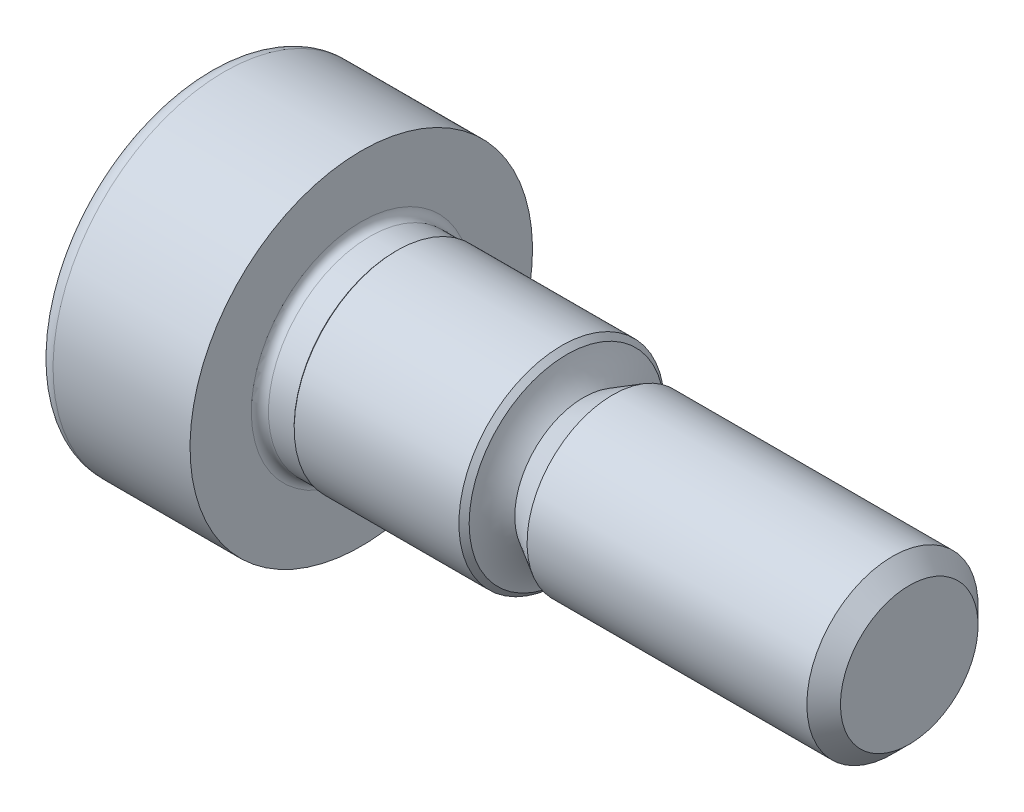
ISO-10303-21;
HEADER;
FILE_DESCRIPTION(('STEP AP214'),'2;1');
FILE_NAME('part.step','',(''),(''),'','','');
FILE_SCHEMA(('AUTOMOTIVE_DESIGN { 1 0 10303 214 1 1 1 1 }'));
ENDSEC;
DATA;
#1=APPLICATION_CONTEXT('core data for automotive mechanical design processes');
#2=APPLICATION_PROTOCOL_DEFINITION('international standard','automotive_design',2000,#1);
#3=PRODUCT_CONTEXT('',#1,'mechanical');
#4=PRODUCT('Part','Part','',(#3));
#5=PRODUCT_RELATED_PRODUCT_CATEGORY('part','',(#4));
#6=PRODUCT_DEFINITION_FORMATION('','',#4);
#7=PRODUCT_DEFINITION_CONTEXT('part definition',#1,'design');
#8=PRODUCT_DEFINITION('design','',#6,#7);
#9=PRODUCT_DEFINITION_SHAPE('','',#8);
#10=(LENGTH_UNIT() NAMED_UNIT(*) SI_UNIT(.MILLI.,.METRE.));
#11=(NAMED_UNIT(*) PLANE_ANGLE_UNIT() SI_UNIT($,.RADIAN.));
#12=(NAMED_UNIT(*) SI_UNIT($,.STERADIAN.) SOLID_ANGLE_UNIT());
#13=UNCERTAINTY_MEASURE_WITH_UNIT(LENGTH_MEASURE(1.E-05),#10,'distance_accuracy_value','');
#14=(GEOMETRIC_REPRESENTATION_CONTEXT(3) GLOBAL_UNCERTAINTY_ASSIGNED_CONTEXT((#13)) GLOBAL_UNIT_ASSIGNED_CONTEXT((#10,
#11,#12)) REPRESENTATION_CONTEXT('',''));
#15=CARTESIAN_POINT('',(0.,0.,0.));
#16=DIRECTION('',(0.,0.,1.));
#17=DIRECTION('',(1.,0.,0.));
#18=AXIS2_PLACEMENT_3D('',#15,#16,#17);
#19=CARTESIAN_POINT('',(-4.5,-0.866025403784439,1.5));
#20=DIRECTION('',(0.,0.,1.));
#21=DIRECTION('',(1.,0.,0.));
#22=AXIS2_PLACEMENT_3D('',#19,#20,#21);
#23=PLANE('',#22);
#24=DIRECTION('',(1.,0.,0.));
#25=VECTOR('',#24,1.);
#26=CARTESIAN_POINT('',(-4.5,-0.86602540378444,1.5));
#27=LINE('',#26,#25);
#28=CARTESIAN_POINT('',(-2.09999998876295,-0.866025360297812,1.5));
#29=VERTEX_POINT('',#28);
#30=CARTESIAN_POINT('',(-4.5,-0.866025403784439,1.5));
#31=VERTEX_POINT('',#30);
#32=EDGE_CURVE('E297',#29,#31,#27,.F.);
#33=ORIENTED_EDGE('',*,*,#32,.T.);
#34=DIRECTION('',(0.,1.,0.));
#35=VECTOR('',#34,1.);
#36=CARTESIAN_POINT('',(-4.5,-0.866025403784439,1.5));
#37=LINE('',#36,#35);
#38=CARTESIAN_POINT('',(-4.5,0.866025403784439,1.5));
#39=VERTEX_POINT('',#38);
#40=EDGE_CURVE('E300',#39,#31,#37,.F.);
#41=ORIENTED_EDGE('',*,*,#40,.F.);
#42=DIRECTION('',(1.,0.,0.));
#43=VECTOR('',#42,1.);
#44=CARTESIAN_POINT('',(-4.5,0.866025403784439,1.5));
#45=LINE('',#44,#43);
#46=CARTESIAN_POINT('',(-2.09999998876207,0.866025425529268,1.49999996233685));
#47=VERTEX_POINT('',#46);
#48=EDGE_CURVE('E94',#39,#47,#45,.T.);
#49=ORIENTED_EDGE('',*,*,#48,.T.);
#50=CARTESIAN_POINT('',(-2.10000003335591,0.86602543025043,1.499999962732));
#51=CARTESIAN_POINT('',(-2.07802167621575,0.789912288066063,1.49999998661501));
#52=CARTESIAN_POINT('',(-2.05803351786078,0.713142136048893,1.4999999964126));
#53=CARTESIAN_POINT('',(-2.02314479379748,0.558272606373841,1.50000000359603));
#54=CARTESIAN_POINT('',(-2.00825656905145,0.480170477878372,1.50000000095198));
#55=CARTESIAN_POINT('',(-1.98508197247781,0.324934102243753,1.49999999907158));
#56=CARTESIAN_POINT('',(-1.97664134289848,0.247823733513013,1.49999999975251));
#57=CARTESIAN_POINT('',(-1.96656687708559,0.0932403553060011,1.50000000024718));
#58=CARTESIAN_POINT('',(-1.96492469633022,0.0157679073123937,1.50000000006199));
#59=CARTESIAN_POINT('',(-1.96834971826331,-0.128981041425857,1.49999999994604));
#60=CARTESIAN_POINT('',(-1.97257596373675,-0.196279262955207,1.49999999998546));
#61=CARTESIAN_POINT('',(-1.98596797275123,-0.33043728007815,1.50000000001456));
#62=CARTESIAN_POINT('',(-1.99513830649323,-0.397296612001995,1.5000000000042));
#63=CARTESIAN_POINT('',(-2.01806236601585,-0.53173100748732,1.49999999999571));
#64=CARTESIAN_POINT('',(-2.03191322005288,-0.599289065147196,1.49999999999786));
#65=CARTESIAN_POINT('',(-2.0633488032568,-0.733397843696797,1.50000000000214));
#66=CARTESIAN_POINT('',(-2.08092615106047,-0.799950281347834,1.50000000000428));
#67=CARTESIAN_POINT('',(-2.09999997622052,-0.866025316849562,1.5));
#68=B_SPLINE_CURVE_WITH_KNOTS('',3,(#50,#51,#52,#53,#54,#55,#56,#57,#58,#59,#60,#61,#62,#63,#64,
#65,#66,#67),.UNSPECIFIED.,.F.,.F.,(4,2,2,2,2,2,2,2,4),(0.,0.237762017438136,0.476095379636202,
0.708530728268836,0.940680697400191,1.1427808461068,1.34506813263149,1.55184118196356,
1.7582084234658),.UNSPECIFIED.);
#69=EDGE_CURVE('E93',#47,#29,#68,.T.);
#70=ORIENTED_EDGE('',*,*,#69,.T.);
#71=EDGE_LOOP('',(#33,#41,#49,#70));
#72=FACE_BOUND('',#71,.T.);
#73=ADVANCED_FACE('F17',(#72),#23,.F.);
#74=CARTESIAN_POINT('',(-4.5,-1.73205080756888,0.));
#75=DIRECTION('',(0.,-0.866025403784439,0.5));
#76=DIRECTION('',(0.,-0.5,-0.866025403784439));
#77=AXIS2_PLACEMENT_3D('',#74,#75,#76);
#78=PLANE('',#77);
#79=DIRECTION('',(1.,0.,0.));
#80=VECTOR('',#79,1.);
#81=CARTESIAN_POINT('',(-4.5,-1.73205080756888,0.));
#82=LINE('',#81,#80);
#83=CARTESIAN_POINT('',(-2.09999998876401,-1.7320507858274,3.76573399172149E-08));
#84=VERTEX_POINT('',#83);
#85=CARTESIAN_POINT('',(-4.5,-1.73205080756888,0.));
#86=VERTEX_POINT('',#85);
#87=EDGE_CURVE('E291',#84,#86,#82,.F.);
#88=ORIENTED_EDGE('',*,*,#87,.T.);
#89=DIRECTION('',(0.,-0.5,-0.866025403784439));
#90=VECTOR('',#89,1.);
#91=CARTESIAN_POINT('',(-4.5,-1.73205080756888,0.));
#92=LINE('',#91,#90);
#93=EDGE_CURVE('E294',#31,#86,#92,.T.);
#94=ORIENTED_EDGE('',*,*,#93,.F.);
#95=ORIENTED_EDGE('',*,*,#32,.F.);
#96=CARTESIAN_POINT('',(-2.10000003335301,-0.866025358280918,1.50000000428221));
#97=CARTESIAN_POINT('',(-2.07802167621377,-0.904081950055329,1.4340841015296));
#98=CARTESIAN_POINT('',(-2.05803351785928,-0.942467034548381,1.36759920452899));
#99=CARTESIAN_POINT('',(-2.02314479379654,-1.01990180560644,1.23347826115009));
#100=CARTESIAN_POINT('',(-2.0082565690506,-1.05895286756437,1.16583983246162));
#101=CARTESIAN_POINT('',(-1.98508197247722,-1.13657105375308,1.03140118663082));
#102=CARTESIAN_POINT('',(-1.97664134289806,-1.17512623870803,0.964621648755426));
#103=CARTESIAN_POINT('',(-1.96656687708545,-1.25241792823972,0.830748516473002));
#104=CARTESIAN_POINT('',(-1.96492469633021,-1.29115415207604,0.763655408324757));
#105=CARTESIAN_POINT('',(-1.96834971826349,-1.3635286263448,0.638299141488293));
#106=CARTESIAN_POINT('',(-1.97257596373706,-1.39717773714376,0.580017172033811));
#107=CARTESIAN_POINT('',(-1.98596797275181,-1.46425674573073,0.463832921098034));
#108=CARTESIAN_POINT('',(-1.99513830649398,-1.49768641168382,0.405931041166498));
#109=CARTESIAN_POINT('',(-2.01806236601693,-1.56490360941942,0.289507439529062));
#110=CARTESIAN_POINT('',(-2.03191322005415,-1.59868263825136,0.231000445366106));
#111=CARTESIAN_POINT('',(-2.06334880325844,-1.66573702753014,0.114858836273319));
#112=CARTESIAN_POINT('',(-2.0809261510623,-1.69901324635764,0.0572227345845793));
#113=CARTESIAN_POINT('',(-2.09999997622254,-1.73205076410493,7.52817598523479E-08));
#114=B_SPLINE_CURVE_WITH_KNOTS('',3,(#96,#97,#98,#99,#100,#101,#102,#103,#104,#105,#106,#107,
#108,#109,#110,#111,#112,#113),.UNSPECIFIED.,.F.,.F.,(4,2,2,2,2,2,2,2,4),(0.,0.237762017437402,
0.476095379634763,0.708530728266777,0.9406806973975,1.14278084610503,1.34506813263064,
1.55184118196365,1.7582084234668),.UNSPECIFIED.);
#115=EDGE_CURVE('E134',#29,#84,#114,.T.);
#116=ORIENTED_EDGE('',*,*,#115,.T.);
#117=EDGE_LOOP('',(#88,#94,#95,#116));
#118=FACE_BOUND('',#117,.T.);
#119=ADVANCED_FACE('F138',(#118),#78,.F.);
#120=CARTESIAN_POINT('',(-4.5,-0.86602540378444,-1.5));
#121=DIRECTION('',(0.,-0.866025403784439,-0.5));
#122=DIRECTION('',(0.,0.5,-0.866025403784439));
#123=AXIS2_PLACEMENT_3D('',#120,#121,#122);
#124=PLANE('',#123);
#125=DIRECTION('',(-1.,0.,0.));
#126=VECTOR('',#125,1.);
#127=CARTESIAN_POINT('',(-4.5,-0.866025403784439,-1.5));
#128=LINE('',#127,#126);
#129=CARTESIAN_POINT('',(-2.09999998876513,-0.866025425523976,-1.49999996234602));
#130=VERTEX_POINT('',#129);
#131=CARTESIAN_POINT('',(-4.5,-0.866025403784439,-1.5));
#132=VERTEX_POINT('',#131);
#133=EDGE_CURVE('E282',#130,#132,#128,.T.);
#134=ORIENTED_EDGE('',*,*,#133,.T.);
#135=DIRECTION('',(0.,0.5,-0.866025403784439));
#136=VECTOR('',#135,1.);
#137=CARTESIAN_POINT('',(-4.5,-0.86602540378444,-1.5));
#138=LINE('',#137,#136);
#139=EDGE_CURVE('E285',#86,#132,#138,.T.);
#140=ORIENTED_EDGE('',*,*,#139,.F.);
#141=ORIENTED_EDGE('',*,*,#87,.F.);
#142=CARTESIAN_POINT('',(-2.1000000333495,-1.73205078852413,4.15411377184599E-08));
#143=CARTESIAN_POINT('',(-2.07802167621137,-1.69399423811292,-0.0659158850925118));
#144=CARTESIAN_POINT('',(-2.05803351785746,-1.65560917058849,-0.132400791889771));
#145=CARTESIAN_POINT('',(-2.02314479379541,-1.57817441197169,-0.266521742451139));
#146=CARTESIAN_POINT('',(-2.00825656904958,-1.53912334543465,-0.334160168495541));
#147=CARTESIAN_POINT('',(-1.98508197247651,-1.46150515598951,-0.468598812445655));
#148=CARTESIAN_POINT('',(-1.97664134289755,-1.42294997221399,-0.535378351001732));
#149=CARTESIAN_POINT('',(-1.9665668770853,-1.34565828353927,-0.669251483778371));
#150=CARTESIAN_POINT('',(-1.96492469633019,-1.30692205938233,-0.736344591741212));
#151=CARTESIAN_POINT('',(-1.96834971826371,-1.23454758491275,-0.861700858461751));
#152=CARTESIAN_POINT('',(-1.97257596373742,-1.20089847418193,-0.91998282795588));
#153=CARTESIAN_POINT('',(-1.98596797275248,-1.13381946564509,-1.03616707892122));
#154=CARTESIAN_POINT('',(-1.99513830649481,-1.10038979967393,-1.09406895884262));
#155=CARTESIAN_POINT('',(-2.01806236601812,-1.03317260192337,-1.21049256047201));
#156=CARTESIAN_POINT('',(-2.03191322005552,-0.99939357309503,-1.26899955463732));
#157=CARTESIAN_POINT('',(-2.06334880326019,-0.932339183823426,-1.38514116373481));
#158=CARTESIAN_POINT('',(-2.08092615106424,-0.899062964999509,-1.44277726542588));
#159=CARTESIAN_POINT('',(-2.09999997622466,-0.866025447244699,-1.49999992472462));
#160=B_SPLINE_CURVE_WITH_KNOTS('',3,(#142,#143,#144,#145,#146,#147,#148,#149,#150,#151,#152,
#153,#154,#155,#156,#157,#158,#159),.UNSPECIFIED.,.F.,.F.,(4,2,2,2,2,2,2,2,4),(0.,
0.237762017436511,0.476095379633014,0.708530728264277,0.940680697394235,1.14278084610259,
1.34506813262905,1.55184118196289,1.75820842346686),.UNSPECIFIED.);
#161=EDGE_CURVE('E129',#84,#130,#160,.T.);
#162=ORIENTED_EDGE('',*,*,#161,.T.);
#163=EDGE_LOOP('',(#134,#140,#141,#162));
#164=FACE_BOUND('',#163,.T.);
#165=ADVANCED_FACE('F141',(#164),#124,.F.);
#166=CARTESIAN_POINT('',(-4.5,0.866025403784438,-1.5));
#167=DIRECTION('',(0.,0.,-1.));
#168=DIRECTION('',(-1.,0.,0.));
#169=AXIS2_PLACEMENT_3D('',#166,#167,#168);
#170=PLANE('',#169);
#171=DIRECTION('',(1.,0.,0.));
#172=VECTOR('',#171,1.);
#173=CARTESIAN_POINT('',(-4.5,0.86602540378444,-1.5));
#174=LINE('',#173,#172);
#175=CARTESIAN_POINT('',(-2.09999999352039,0.866025352058319,-1.50000001427197));
#176=VERTEX_POINT('',#175);
#177=CARTESIAN_POINT('',(-4.5,0.866025403784439,-1.5));
#178=VERTEX_POINT('',#177);
#179=EDGE_CURVE('E85',#176,#178,#174,.F.);
#180=ORIENTED_EDGE('',*,*,#179,.T.);
#181=DIRECTION('',(0.,1.,0.));
#182=VECTOR('',#181,1.);
#183=CARTESIAN_POINT('',(-4.5,0.866025403784438,-1.5));
#184=LINE('',#183,#182);
#185=EDGE_CURVE('E41',#132,#178,#184,.T.);
#186=ORIENTED_EDGE('',*,*,#185,.F.);
#187=ORIENTED_EDGE('',*,*,#133,.F.);
#188=CARTESIAN_POINT('',(-2.10000003334579,-0.866025430230415,-1.49999996273862));
#189=CARTESIAN_POINT('',(-2.07802167620883,-0.789912288046103,-1.49999998661738));
#190=CARTESIAN_POINT('',(-2.05803351785554,-0.713142136029389,-1.49999999641323));
#191=CARTESIAN_POINT('',(-2.02314479379422,-0.558272606355601,-1.50000000359539));
#192=CARTESIAN_POINT('',(-2.0082565690485,-0.480170477860938,-1.50000000095181));
#193=CARTESIAN_POINT('',(-1.98508197247576,-0.324934102227769,-1.49999999907174));
#194=CARTESIAN_POINT('',(-1.97664134289702,-0.247823733497672,-1.49999999975256));
#195=CARTESIAN_POINT('',(-1.96656687708513,-0.093240355292028,-1.50000000024714));
#196=CARTESIAN_POINT('',(-1.96492469633017,-0.0157679072991463,-1.50000000006198));
#197=CARTESIAN_POINT('',(-1.9683497182639,0.128981041437423,-1.49999999994605));
#198=CARTESIAN_POINT('',(-1.97257596373757,0.196279262965822,-1.49999999998546));
#199=CARTESIAN_POINT('',(-1.98596797275234,0.330437280086866,-1.50000000001456));
#200=CARTESIAN_POINT('',(-1.9951383064944,0.397296612009763,-1.5000000000042));
#201=CARTESIAN_POINT('',(-2.01806236601699,0.531731007493114,-1.49999999999571));
#202=CARTESIAN_POINT('',(-2.03191322005393,0.599289065151964,-1.49999999999786));
#203=CARTESIAN_POINT('',(-2.06334880325752,0.73339784369953,-1.50000000000214));
#204=CARTESIAN_POINT('',(-2.08092615106096,0.799950281349558,-1.50000000000427));
#205=CARTESIAN_POINT('',(-2.09999997622073,0.866025316850293,-1.5));
#206=B_SPLINE_CURVE_WITH_KNOTS('',3,(#188,#189,#190,#191,#192,#193,#194,#195,#196,#197,#198,
#199,#200,#201,#202,#203,#204,#205),.UNSPECIFIED.,.F.,.F.,(4,2,2,2,2,2,2,2,4),(0.,
0.23776201743555,0.476095379631123,0.708530728261617,0.940680697390792,1.1427808460946,
1.34506813261651,1.55184118194551,1.75820842344466),.UNSPECIFIED.);
#207=EDGE_CURVE('E108',#130,#176,#206,.T.);
#208=ORIENTED_EDGE('',*,*,#207,.T.);
#209=EDGE_LOOP('',(#180,#186,#187,#208));
#210=FACE_BOUND('',#209,.T.);
#211=ADVANCED_FACE('F145',(#210),#170,.F.);
#212=CARTESIAN_POINT('',(-4.5,0.866025403784439,1.5));
#213=DIRECTION('',(0.,0.866025403784439,0.5));
#214=DIRECTION('',(0.,-0.5,0.866025403784439));
#215=AXIS2_PLACEMENT_3D('',#212,#213,#214);
#216=PLANE('',#215);
#217=ORIENTED_EDGE('',*,*,#48,.F.);
#218=DIRECTION('',(0.,-0.5,0.866025403784439));
#219=VECTOR('',#218,1.);
#220=CARTESIAN_POINT('',(-4.5,0.866025403784439,1.5));
#221=LINE('',#220,#219);
#222=CARTESIAN_POINT('',(-4.5,1.73205080756888,0.));
#223=VERTEX_POINT('',#222);
#224=EDGE_CURVE('E80',#223,#39,#221,.T.);
#225=ORIENTED_EDGE('',*,*,#224,.F.);
#226=DIRECTION('',(1.,0.,0.));
#227=VECTOR('',#226,1.);
#228=CARTESIAN_POINT('',(-4.5,1.73205080756888,0.));
#229=LINE('',#228,#227);
#230=CARTESIAN_POINT('',(-2.09999998876953,1.73205078583697,3.76407683635191E-08));
#231=VERTEX_POINT('',#230);
#232=EDGE_CURVE('E75',#223,#231,#229,.T.);
#233=ORIENTED_EDGE('',*,*,#232,.T.);
#234=CARTESIAN_POINT('',(-2.09999997607234,1.73205076434208,7.53682930359305E-08));
#235=CARTESIAN_POINT('',(-2.07802163700995,1.69399419326496,0.065915989717045));
#236=CARTESIAN_POINT('',(-2.05803348815855,1.65560911849432,0.132400889341389));
#237=CARTESIAN_POINT('',(-2.02314477534975,1.57817435719423,0.266521830089263));
#238=CARTESIAN_POINT('',(-2.0082565523481,1.5391232952474,0.334160253505964));
#239=CARTESIAN_POINT('',(-1.98508196087722,1.46150511154693,0.468598891291491));
#240=CARTESIAN_POINT('',(-1.97664133465609,1.42294992899799,0.535378426352266));
#241=CARTESIAN_POINT('',(-1.96656687450187,1.34565824376655,0.669251552169136));
#242=CARTESIAN_POINT('',(-1.96492469604129,1.30692202182537,0.736344656666988));
#243=CARTESIAN_POINT('',(-1.968349721606,1.23454755239127,0.861700914899243));
#244=CARTESIAN_POINT('',(-1.97257596833489,1.20089844449588,0.919982879402893));
#245=CARTESIAN_POINT('',(-1.9859679788723,1.13381944165857,1.03616712043779));
#246=CARTESIAN_POINT('',(-1.99513831288396,1.10038977855167,1.09406899541898));
#247=CARTESIAN_POINT('',(-2.01806237202797,1.03317258674697,1.21049258676694));
#248=CARTESIAN_POINT('',(-2.03191322536921,0.999393560996331,1.2689995755972));
#249=CARTESIAN_POINT('',(-2.06334880642921,0.932339177826785,1.38514117411699));
#250=CARTESIAN_POINT('',(-2.08092615278305,0.899062962027001,1.44277727056581));
#251=CARTESIAN_POINT('',(-2.09999997621886,0.866025447254756,1.4999999247072));
#252=B_SPLINE_CURVE_WITH_KNOTS('',3,(#234,#235,#236,#237,#238,#239,#240,#241,#242,#243,#244,
#245,#246,#247,#248,#249,#250,#251),.UNSPECIFIED.,.F.,.F.,(4,2,2,2,2,2,2,2,4),(0.,
0.237762002787343,0.476095350855917,0.708530687368618,0.940680644156362,1.14278077595019,
1.34506804567278,1.55184107652068,1.75820829940149),.UNSPECIFIED.);
#253=EDGE_CURVE('E21',#231,#47,#252,.T.);
#254=ORIENTED_EDGE('',*,*,#253,.T.);
#255=EDGE_LOOP('',(#217,#225,#233,#254));
#256=FACE_BOUND('',#255,.T.);
#257=ADVANCED_FACE('F78',(#256),#216,.F.);
#258=CARTESIAN_POINT('',(-2.10600000099248,0.,0.));
#259=DIRECTION('',(-1.,0.,0.));
#260=DIRECTION('',(0.,0.,1.));
#261=AXIS2_PLACEMENT_3D('',#258,#259,#260);
#262=CONICAL_SURFACE('',#261,1.74244311182292,1.04719754993706);
#263=CARTESIAN_POINT('',(-1.09999999847332,-1.13686837721616E-10,0.));
#264=VERTEX_POINT('',#263);
#265=VERTEX_LOOP('',#264);
#266=FACE_BOUND('',#265,.T.);
#267=ORIENTED_EDGE('',*,*,#207,.F.);
#268=ORIENTED_EDGE('',*,*,#161,.F.);
#269=ORIENTED_EDGE('',*,*,#115,.F.);
#270=ORIENTED_EDGE('',*,*,#69,.F.);
#271=ORIENTED_EDGE('',*,*,#253,.F.);
#272=CARTESIAN_POINT('',(-2.10000003333847,1.7320507885456,4.15377531092966E-08));
#273=CARTESIAN_POINT('',(-2.07802167619792,1.69399423810413,-0.0659158851223118));
#274=CARTESIAN_POINT('',(-2.05803351783864,1.65560917055646,-0.132400791949155));
#275=CARTESIAN_POINT('',(-2.02314479376596,1.57817441189658,-0.266521742577318));
#276=CARTESIAN_POINT('',(-2.0082565690152,1.53912334533968,-0.334160168659002));
#277=CARTESIAN_POINT('',(-1.98508197245359,1.46150515589311,-0.468598812613634));
#278=CARTESIAN_POINT('',(-1.97664134288449,1.42294997213657,-0.535378351136093));
#279=CARTESIAN_POINT('',(-1.96656687708362,1.34565828350371,-0.669251483839694));
#280=CARTESIAN_POINT('',(-1.96492469632972,1.30692205936966,-0.7363445917631));
#281=CARTESIAN_POINT('',(-1.96834971849202,1.23454758010802,-0.861700866783856));
#282=CARTESIAN_POINT('',(-1.97257596494851,1.20089846457259,-0.919982844599752));
#283=CARTESIAN_POINT('',(-1.98596797728177,1.13381944650639,-1.0361671120704));
#284=CARTESIAN_POINT('',(-1.99513831336272,1.10038977581065,-1.09406900017503));
#285=CARTESIAN_POINT('',(-2.01806237871744,1.03317256850163,-1.21049261836016));
#286=CARTESIAN_POINT('',(-2.03191323628987,0.999393534844095,-1.26899962088989));
#287=CARTESIAN_POINT('',(-2.06334882733353,0.932339136089832,-1.38514124641182));
#288=CARTESIAN_POINT('',(-2.08092617943684,0.899062912611812,-1.44277735616403));
#289=CARTESIAN_POINT('',(-2.10000000912008,0.866025390268167,-1.50000002341087));
#290=B_SPLINE_CURVE_WITH_KNOTS('',3,(#272,#273,#274,#275,#276,#277,#278,#279,#280,#281,#282,
#283,#284,#285,#286,#287,#288,#289),.UNSPECIFIED.,.F.,.F.,(4,2,2,2,2,2,2,2,4),(0.,
0.237762017548545,0.47609537987229,0.708530728384054,0.940680697383601,1.14278087496024,
1.34506819046188,1.55184127027516,1.75820854202636),.UNSPECIFIED.);
#291=EDGE_CURVE('E84',#231,#176,#290,.T.);
#292=ORIENTED_EDGE('',*,*,#291,.T.);
#293=EDGE_LOOP('',(#267,#268,#269,#270,#271,#292));
#294=FACE_BOUND('',#293,.T.);
#295=ADVANCED_FACE('F90',(#266,#294),#262,.F.);
#296=CARTESIAN_POINT('',(-4.5,1.73205080756888,0.));
#297=DIRECTION('',(0.,0.866025403784439,-0.5));
#298=DIRECTION('',(0.,0.5,0.866025403784439));
#299=AXIS2_PLACEMENT_3D('',#296,#297,#298);
#300=PLANE('',#299);
#301=ORIENTED_EDGE('',*,*,#232,.F.);
#302=DIRECTION('',(0.,0.5,0.866025403784438));
#303=VECTOR('',#302,1.);
#304=CARTESIAN_POINT('',(-4.5,0.866025403784438,-1.5));
#305=LINE('',#304,#303);
#306=EDGE_CURVE('E96',#178,#223,#305,.T.);
#307=ORIENTED_EDGE('',*,*,#306,.F.);
#308=ORIENTED_EDGE('',*,*,#179,.F.);
#309=ORIENTED_EDGE('',*,*,#291,.F.);
#310=EDGE_LOOP('',(#301,#307,#308,#309));
#311=FACE_BOUND('',#310,.T.);
#312=ADVANCED_FACE('F95',(#311),#300,.F.);
#313=CARTESIAN_POINT('',(-4.5,3.36602540378444,0.));
#314=DIRECTION('',(-1.,0.,0.));
#315=DIRECTION('',(0.,0.,1.));
#316=AXIS2_PLACEMENT_3D('',#313,#314,#315);
#317=PLANE('',#316);
#318=ORIENTED_EDGE('',*,*,#185,.T.);
#319=ORIENTED_EDGE('',*,*,#306,.T.);
#320=ORIENTED_EDGE('',*,*,#224,.T.);
#321=ORIENTED_EDGE('',*,*,#40,.T.);
#322=ORIENTED_EDGE('',*,*,#93,.T.);
#323=ORIENTED_EDGE('',*,*,#139,.T.);
#324=EDGE_LOOP('',(#318,#319,#320,#321,#322,#323));
#325=FACE_BOUND('',#324,.T.);
#326=CARTESIAN_POINT('',(-4.5,0.,0.));
#327=DIRECTION('',(1.,0.,0.));
#328=DIRECTION('',(0.,1.,0.));
#329=AXIS2_PLACEMENT_3D('',#326,#327,#328);
#330=CIRCLE('',#329,4.5);
#331=CARTESIAN_POINT('',(-4.5,4.5,0.));
#332=VERTEX_POINT('',#331);
#333=EDGE_CURVE('E98',#332,#332,#330,.T.);
#334=ORIENTED_EDGE('',*,*,#333,.F.);
#335=EDGE_LOOP('',(#334));
#336=FACE_BOUND('',#335,.T.);
#337=ADVANCED_FACE('F254',(#325,#336),#317,.T.);
#338=CARTESIAN_POINT('',(-4.,0.,0.));
#339=DIRECTION('',(1.,0.,0.));
#340=DIRECTION('',(0.,0.,-1.));
#341=AXIS2_PLACEMENT_3D('',#338,#339,#340);
#342=TOROIDAL_SURFACE('',#341,4.5,0.5);
#343=CARTESIAN_POINT('',(-4.,0.,0.));
#344=DIRECTION('',(1.,0.,0.));
#345=DIRECTION('',(0.,1.,0.));
#346=AXIS2_PLACEMENT_3D('',#343,#344,#345);
#347=CIRCLE('',#346,5.);
#348=CARTESIAN_POINT('',(-4.,5.,0.));
#349=VERTEX_POINT('',#348);
#350=EDGE_CURVE('E235',#349,#349,#347,.T.);
#351=ORIENTED_EDGE('',*,*,#350,.F.);
#352=EDGE_LOOP('',(#351));
#353=FACE_BOUND('',#352,.T.);
#354=ORIENTED_EDGE('',*,*,#333,.T.);
#355=EDGE_LOOP('',(#354));
#356=FACE_BOUND('',#355,.T.);
#357=ADVANCED_FACE('F250',(#353,#356),#342,.T.);
#358=CARTESIAN_POINT('',(-2.25,0.,0.));
#359=DIRECTION('',(1.,0.,0.));
#360=DIRECTION('',(0.,1.,0.));
#361=AXIS2_PLACEMENT_3D('',#358,#359,#360);
#362=CYLINDRICAL_SURFACE('',#361,5.);
#363=ORIENTED_EDGE('',*,*,#350,.T.);
#364=EDGE_LOOP('',(#363));
#365=FACE_BOUND('',#364,.T.);
#366=CARTESIAN_POINT('',(0.,0.,0.));
#367=DIRECTION('',(1.,0.,0.));
#368=DIRECTION('',(0.,1.,0.));
#369=AXIS2_PLACEMENT_3D('',#366,#367,#368);
#370=CIRCLE('',#369,5.);
#371=CARTESIAN_POINT('',(0.,5.,0.));
#372=VERTEX_POINT('',#371);
#373=EDGE_CURVE('E106',#372,#372,#370,.T.);
#374=ORIENTED_EDGE('',*,*,#373,.F.);
#375=EDGE_LOOP('',(#374));
#376=FACE_BOUND('',#375,.T.);
#377=ADVANCED_FACE('F253',(#365,#376),#362,.T.);
#378=CARTESIAN_POINT('',(0.,4.,0.));
#379=DIRECTION('',(1.,0.,0.));
#380=DIRECTION('',(0.,0.,-1.));
#381=AXIS2_PLACEMENT_3D('',#378,#379,#380);
#382=PLANE('',#381);
#383=CARTESIAN_POINT('',(0.,0.,0.));
#384=DIRECTION('',(1.,0.,0.));
#385=DIRECTION('',(0.,1.,0.));
#386=AXIS2_PLACEMENT_3D('',#383,#384,#385);
#387=CIRCLE('',#386,3.21);
#388=CARTESIAN_POINT('',(0.,3.21,0.));
#389=VERTEX_POINT('',#388);
#390=EDGE_CURVE('E210',#389,#389,#387,.F.);
#391=ORIENTED_EDGE('',*,*,#390,.T.);
#392=EDGE_LOOP('',(#391));
#393=FACE_BOUND('',#392,.T.);
#394=ORIENTED_EDGE('',*,*,#373,.T.);
#395=EDGE_LOOP('',(#394));
#396=FACE_BOUND('',#395,.T.);
#397=ADVANCED_FACE('F224',(#393,#396),#382,.T.);
#398=CARTESIAN_POINT('',(0.250000000000002,0.,0.));
#399=DIRECTION('',(-1.,0.,0.));
#400=DIRECTION('',(0.,0.,1.));
#401=AXIS2_PLACEMENT_3D('',#398,#399,#400);
#402=TOROIDAL_SURFACE('',#401,3.21,0.25);
#403=ORIENTED_EDGE('',*,*,#390,.F.);
#404=EDGE_LOOP('',(#403));
#405=FACE_BOUND('',#404,.T.);
#406=CARTESIAN_POINT('',(0.250000000000002,0.,0.));
#407=DIRECTION('',(-1.,0.,0.));
#408=DIRECTION('',(0.,-1.,0.));
#409=AXIS2_PLACEMENT_3D('',#406,#407,#408);
#410=CIRCLE('',#409,2.96);
#411=CARTESIAN_POINT('',(0.250000000000002,-2.96,0.));
#412=VERTEX_POINT('',#411);
#413=EDGE_CURVE('E205',#412,#412,#410,.F.);
#414=ORIENTED_EDGE('',*,*,#413,.F.);
#415=EDGE_LOOP('',(#414));
#416=FACE_BOUND('',#415,.T.);
#417=ADVANCED_FACE('F218',(#405,#416),#402,.F.);
#418=CARTESIAN_POINT('',(0.5,0.,0.));
#419=DIRECTION('',(-1.,0.,0.));
#420=DIRECTION('',(0.,-1.,0.));
#421=AXIS2_PLACEMENT_3D('',#418,#419,#420);
#422=CYLINDRICAL_SURFACE('',#421,2.96);
#423=ORIENTED_EDGE('',*,*,#413,.T.);
#424=EDGE_LOOP('',(#423));
#425=FACE_BOUND('',#424,.T.);
#426=CARTESIAN_POINT('',(1.0000000000332,0.,0.));
#427=DIRECTION('',(1.,0.,0.));
#428=DIRECTION('',(0.,1.,0.));
#429=AXIS2_PLACEMENT_3D('',#426,#427,#428);
#430=CIRCLE('',#429,2.96000000008689);
#431=CARTESIAN_POINT('',(1.0000000000332,2.96000000008689,0.));
#432=VERTEX_POINT('',#431);
#433=EDGE_CURVE('E200',#432,#432,#430,.T.);
#434=ORIENTED_EDGE('',*,*,#433,.F.);
#435=EDGE_LOOP('',(#434));
#436=FACE_BOUND('',#435,.T.);
#437=ADVANCED_FACE('F223',(#425,#436),#422,.T.);
#438=CARTESIAN_POINT('',(1.03999999981852,0.,0.));
#439=DIRECTION('',(1.,0.,0.));
#440=DIRECTION('',(0.,0.,-1.));
#441=AXIS2_PLACEMENT_3D('',#438,#439,#440);
#442=CONICAL_SURFACE('',#441,2.99999999981537,0.785398162686906);
#443=ORIENTED_EDGE('',*,*,#433,.T.);
#444=EDGE_LOOP('',(#443));
#445=FACE_BOUND('',#444,.T.);
#446=CARTESIAN_POINT('',(1.04,0.,0.));
#447=DIRECTION('',(1.,0.,0.));
#448=DIRECTION('',(0.,1.,0.));
#449=AXIS2_PLACEMENT_3D('',#446,#447,#448);
#450=CIRCLE('',#449,3.);
#451=CARTESIAN_POINT('',(1.04,3.,0.));
#452=VERTEX_POINT('',#451);
#453=EDGE_CURVE('E195',#452,#452,#450,.T.);
#454=ORIENTED_EDGE('',*,*,#453,.F.);
#455=EDGE_LOOP('',(#454));
#456=FACE_BOUND('',#455,.T.);
#457=ADVANCED_FACE('F419',(#445,#456),#442,.T.);
#458=CARTESIAN_POINT('',(3.,0.,0.));
#459=DIRECTION('',(1.,0.,0.));
#460=DIRECTION('',(0.,1.,0.));
#461=AXIS2_PLACEMENT_3D('',#458,#459,#460);
#462=CYLINDRICAL_SURFACE('',#461,3.);
#463=CARTESIAN_POINT('',(5.85000000000946,0.,0.));
#464=DIRECTION('',(-1.,0.,0.));
#465=DIRECTION('',(0.,-1.,0.));
#466=AXIS2_PLACEMENT_3D('',#463,#464,#465);
#467=CIRCLE('',#466,2.99999999992906);
#468=CARTESIAN_POINT('',(5.85000000000946,-2.99999999992906,0.));
#469=VERTEX_POINT('',#468);
#470=EDGE_CURVE('E190',#469,#469,#467,.F.);
#471=ORIENTED_EDGE('',*,*,#470,.F.);
#472=EDGE_LOOP('',(#471));
#473=FACE_BOUND('',#472,.T.);
#474=ORIENTED_EDGE('',*,*,#453,.T.);
#475=EDGE_LOOP('',(#474));
#476=FACE_BOUND('',#475,.T.);
#477=ADVANCED_FACE('F428',(#473,#476),#462,.T.);
#478=CARTESIAN_POINT('',(5.85000000000946,0.,0.));
#479=DIRECTION('',(-1.,0.,0.));
#480=DIRECTION('',(0.,0.,1.));
#481=AXIS2_PLACEMENT_3D('',#478,#479,#480);
#482=CONICAL_SURFACE('',#481,2.99999999992906,0.785398162450058);
#483=CARTESIAN_POINT('',(6.,0.,0.));
#484=DIRECTION('',(-1.,0.,0.));
#485=DIRECTION('',(0.,1.,0.));
#486=AXIS2_PLACEMENT_3D('',#483,#484,#485);
#487=CIRCLE('',#486,2.85);
#488=CARTESIAN_POINT('',(6.,2.85,0.));
#489=VERTEX_POINT('',#488);
#490=EDGE_CURVE('E186',#489,#489,#487,.T.);
#491=ORIENTED_EDGE('',*,*,#490,.T.);
#492=EDGE_LOOP('',(#491));
#493=FACE_BOUND('',#492,.T.);
#494=ORIENTED_EDGE('',*,*,#470,.T.);
#495=EDGE_LOOP('',(#494));
#496=FACE_BOUND('',#495,.T.);
#497=ADVANCED_FACE('F178',(#493,#496),#482,.T.);
#498=CARTESIAN_POINT('',(7.92071821937337,0.,0.));
#499=DIRECTION('',(-1.,0.,0.));
#500=DIRECTION('',(0.,1.,0.));
#501=AXIS2_PLACEMENT_3D('',#498,#499,#500);
#502=TOROIDAL_SURFACE('',#501,3.4075316329745,2.);
#503=ORIENTED_EDGE('',*,*,#490,.F.);
#504=EDGE_LOOP('',(#503));
#505=FACE_BOUND('',#504,.T.);
#506=CARTESIAN_POINT('',(6.490759999906,0.,0.));
#507=DIRECTION('',(1.,0.,0.));
#508=DIRECTION('',(0.,1.,0.));
#509=AXIS2_PLACEMENT_3D('',#506,#507,#508);
#510=CIRCLE('',#509,2.00924000023406);
#511=CARTESIAN_POINT('',(6.490759999906,2.00924000023406,0.));
#512=VERTEX_POINT('',#511);
#513=EDGE_CURVE('E189',#512,#512,#510,.T.);
#514=ORIENTED_EDGE('',*,*,#513,.F.);
#515=EDGE_LOOP('',(#514));
#516=FACE_BOUND('',#515,.T.);
#517=ADVANCED_FACE('F173',(#505,#516),#502,.F.);
#518=CARTESIAN_POINT('',(16.,1.25,0.));
#519=DIRECTION('',(1.,0.,0.));
#520=DIRECTION('',(0.,0.,-1.));
#521=AXIS2_PLACEMENT_3D('',#518,#519,#520);
#522=PLANE('',#521);
#523=CARTESIAN_POINT('',(16.0000000001901,0.,0.));
#524=DIRECTION('',(-1.,0.,0.));
#525=DIRECTION('',(0.,0.,1.));
#526=AXIS2_PLACEMENT_3D('',#523,#524,#525);
#527=CIRCLE('',#526,2.00924000017721);
#528=CARTESIAN_POINT('',(16.0000000001901,0.,2.00924000017721));
#529=VERTEX_POINT('',#528);
#530=EDGE_CURVE('E311',#529,#529,#527,.T.);
#531=ORIENTED_EDGE('',*,*,#530,.F.);
#532=EDGE_LOOP('',(#531));
#533=FACE_BOUND('',#532,.T.);
#534=ADVANCED_FACE('F169',(#533),#522,.T.);
#535=CARTESIAN_POINT('',(7.34078125441329,0.,0.));
#536=DIRECTION('',(1.,0.,0.));
#537=DIRECTION('',(0.,0.,-1.));
#538=AXIS2_PLACEMENT_3D('',#535,#536,#537);
#539=CONICAL_SURFACE('',#538,2.49999999965667,0.5235987749792);
#540=ORIENTED_EDGE('',*,*,#513,.T.);
#541=EDGE_LOOP('',(#540));
#542=FACE_BOUND('',#541,.T.);
#543=CARTESIAN_POINT('',(7.34078125432254,0.,0.));
#544=DIRECTION('',(1.,0.,0.));
#545=DIRECTION('',(0.,1.,0.));
#546=AXIS2_PLACEMENT_3D('',#543,#544,#545);
#547=CIRCLE('',#546,2.5);
#548=CARTESIAN_POINT('',(7.34078125432254,2.5,0.));
#549=VERTEX_POINT('',#548);
#550=EDGE_CURVE('E32',#549,#549,#547,.T.);
#551=ORIENTED_EDGE('',*,*,#550,.F.);
#552=EDGE_LOOP('',(#551));
#553=FACE_BOUND('',#552,.T.);
#554=ADVANCED_FACE('F162',(#542,#553),#539,.T.);
#555=CARTESIAN_POINT('',(15.509239999858,0.,0.));
#556=DIRECTION('',(-1.,0.,0.));
#557=DIRECTION('',(0.,0.,1.));
#558=AXIS2_PLACEMENT_3D('',#555,#556,#557);
#559=CONICAL_SURFACE('',#558,2.49999999959982,0.78539816247083);
#560=ORIENTED_EDGE('',*,*,#530,.T.);
#561=EDGE_LOOP('',(#560));
#562=FACE_BOUND('',#561,.T.);
#563=CARTESIAN_POINT('',(15.50924,0.,0.));
#564=DIRECTION('',(1.,0.,0.));
#565=DIRECTION('',(0.,1.,0.));
#566=AXIS2_PLACEMENT_3D('',#563,#564,#565);
#567=CIRCLE('',#566,2.5);
#568=CARTESIAN_POINT('',(15.50924,2.5,0.));
#569=VERTEX_POINT('',#568);
#570=EDGE_CURVE('E11',#569,#569,#567,.F.);
#571=ORIENTED_EDGE('',*,*,#570,.F.);
#572=EDGE_LOOP('',(#571));
#573=FACE_BOUND('',#572,.T.);
#574=ADVANCED_FACE('F156',(#562,#573),#559,.T.);
#575=CARTESIAN_POINT('',(11.,0.,0.));
#576=DIRECTION('',(1.,0.,0.));
#577=DIRECTION('',(0.,1.,0.));
#578=AXIS2_PLACEMENT_3D('',#575,#576,#577);
#579=CYLINDRICAL_SURFACE('',#578,2.5);
#580=ORIENTED_EDGE('',*,*,#570,.T.);
#581=EDGE_LOOP('',(#580));
#582=FACE_BOUND('',#581,.T.);
#583=ORIENTED_EDGE('',*,*,#550,.T.);
#584=EDGE_LOOP('',(#583));
#585=FACE_BOUND('',#584,.T.);
#586=ADVANCED_FACE('F154',(#582,#585),#579,.T.);
#587=CLOSED_SHELL('',(#73,#119,#165,#211,#257,#295,#312,#337,#357,#377,#397,#417,#437,#457,#477,
#497,#517,#534,#554,#574,#586));
#588=MANIFOLD_SOLID_BREP('B1',#587);
#589=ADVANCED_BREP_SHAPE_REPRESENTATION('',(#18,#588),#14);
#590=SHAPE_DEFINITION_REPRESENTATION(#9,#589);
ENDSEC;
END-ISO-10303-21;
